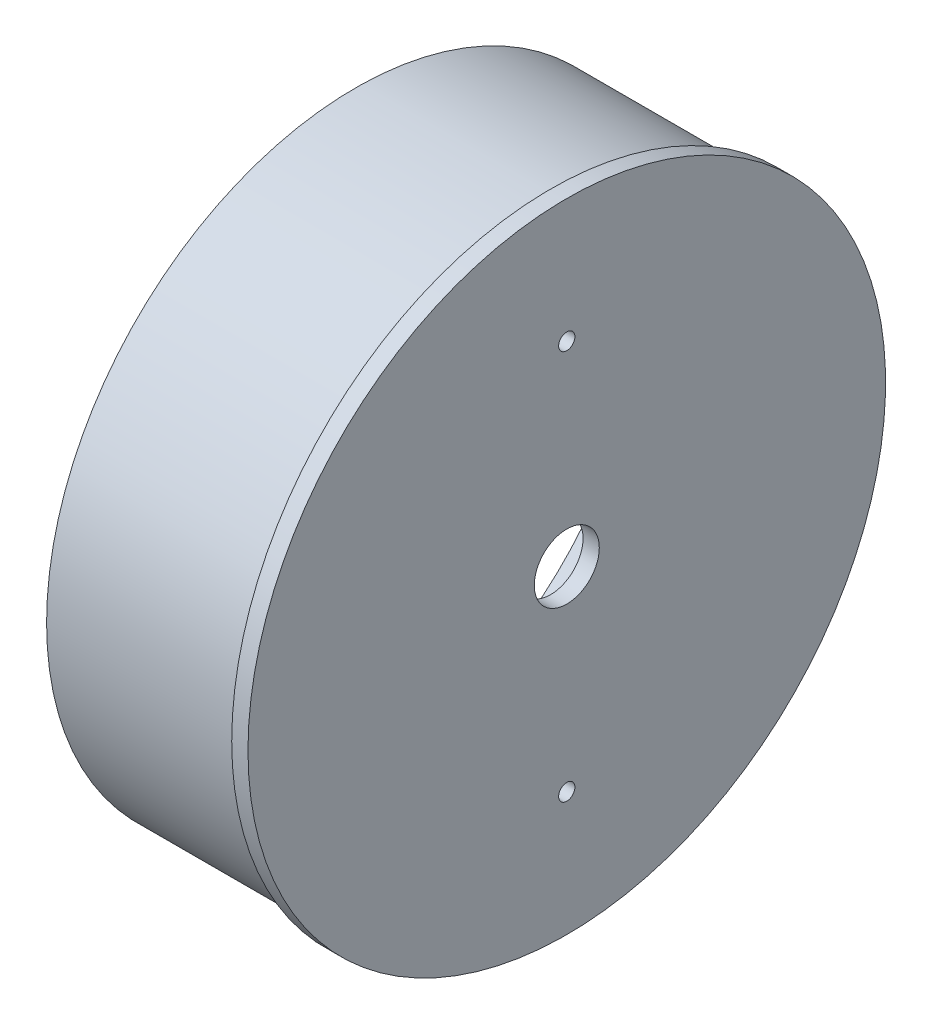
ISO-10303-21;
HEADER;
FILE_DESCRIPTION(('STEP AP214'),'2;1');
FILE_NAME('part.step','',(''),(''),'','','');
FILE_SCHEMA(('AUTOMOTIVE_DESIGN { 1 0 10303 214 1 1 1 1 }'));
ENDSEC;
DATA;
#1=APPLICATION_CONTEXT('core data for automotive mechanical design processes');
#2=APPLICATION_PROTOCOL_DEFINITION('international standard','automotive_design',2000,#1);
#3=PRODUCT_CONTEXT('',#1,'mechanical');
#4=PRODUCT('Part','Part','',(#3));
#5=PRODUCT_RELATED_PRODUCT_CATEGORY('part','',(#4));
#6=PRODUCT_DEFINITION_FORMATION('','',#4);
#7=PRODUCT_DEFINITION_CONTEXT('part definition',#1,'design');
#8=PRODUCT_DEFINITION('design','',#6,#7);
#9=PRODUCT_DEFINITION_SHAPE('','',#8);
#10=(LENGTH_UNIT() NAMED_UNIT(*) SI_UNIT(.MILLI.,.METRE.));
#11=(NAMED_UNIT(*) PLANE_ANGLE_UNIT() SI_UNIT($,.RADIAN.));
#12=(NAMED_UNIT(*) SI_UNIT($,.STERADIAN.) SOLID_ANGLE_UNIT());
#13=UNCERTAINTY_MEASURE_WITH_UNIT(LENGTH_MEASURE(1.E-05),#10,'distance_accuracy_value','');
#14=(GEOMETRIC_REPRESENTATION_CONTEXT(3) GLOBAL_UNCERTAINTY_ASSIGNED_CONTEXT((#13)) GLOBAL_UNIT_ASSIGNED_CONTEXT((#10,
#11,#12)) REPRESENTATION_CONTEXT('',''));
#15=CARTESIAN_POINT('',(0.,0.,0.));
#16=DIRECTION('',(0.,0.,1.));
#17=DIRECTION('',(1.,0.,0.));
#18=AXIS2_PLACEMENT_3D('',#15,#16,#17);
#19=CARTESIAN_POINT('',(9.6263641719796,0.,0.));
#20=DIRECTION('',(1.,0.,0.));
#21=DIRECTION('',(0.,0.,-1.));
#22=AXIS2_PLACEMENT_3D('',#19,#20,#21);
#23=PLANE('',#22);
#24=CARTESIAN_POINT('',(9.6263641719796,-23.7884062483926,0.));
#25=DIRECTION('',(-1.,0.,0.));
#26=DIRECTION('',(0.,0.,1.));
#27=AXIS2_PLACEMENT_3D('',#24,#25,#26);
#28=CIRCLE('',#27,49.03);
#29=CARTESIAN_POINT('',(9.6263641719796,-23.7884062483926,49.03));
#30=VERTEX_POINT('',#29);
#31=EDGE_CURVE('E10',#30,#30,#28,.T.);
#32=ORIENTED_EDGE('',*,*,#31,.F.);
#33=EDGE_LOOP('',(#32));
#34=FACE_BOUND('',#33,.T.);
#35=CARTESIAN_POINT('',(9.6263641719796,-23.7884062483926,0.));
#36=DIRECTION('',(1.,0.,0.));
#37=DIRECTION('',(0.,0.,-1.));
#38=AXIS2_PLACEMENT_3D('',#35,#36,#37);
#39=CIRCLE('',#38,5.);
#40=CARTESIAN_POINT('',(9.6263641719796,-23.7884062483926,-5.));
#41=VERTEX_POINT('',#40);
#42=EDGE_CURVE('E70',#41,#41,#39,.T.);
#43=ORIENTED_EDGE('',*,*,#42,.F.);
#44=EDGE_LOOP('',(#43));
#45=FACE_BOUND('',#44,.T.);
#46=CARTESIAN_POINT('',(9.6263641719796,-53.7884062483926,0.));
#47=DIRECTION('',(1.,0.,0.));
#48=DIRECTION('',(0.,0.,-1.));
#49=AXIS2_PLACEMENT_3D('',#46,#47,#48);
#50=CIRCLE('',#49,1.25);
#51=CARTESIAN_POINT('',(9.6263641719796,-53.7884062483926,-1.25000000000001));
#52=VERTEX_POINT('',#51);
#53=EDGE_CURVE('E131',#52,#52,#50,.T.);
#54=ORIENTED_EDGE('',*,*,#53,.F.);
#55=EDGE_LOOP('',(#54));
#56=FACE_BOUND('',#55,.T.);
#57=CARTESIAN_POINT('',(9.6263641719796,6.21159375160744,0.));
#58=DIRECTION('',(1.,0.,0.));
#59=DIRECTION('',(0.,0.,-1.));
#60=AXIS2_PLACEMENT_3D('',#57,#58,#59);
#61=CIRCLE('',#60,1.25);
#62=CARTESIAN_POINT('',(9.6263641719796,6.21159375160744,-1.25000000000001));
#63=VERTEX_POINT('',#62);
#64=EDGE_CURVE('E134',#63,#63,#61,.F.);
#65=ORIENTED_EDGE('',*,*,#64,.T.);
#66=EDGE_LOOP('',(#65));
#67=FACE_BOUND('',#66,.T.);
#68=ADVANCED_FACE('F47',(#34,#45,#56,#67),#23,.T.);
#69=CARTESIAN_POINT('',(7.12636417197965,0.,0.));
#70=DIRECTION('',(1.,0.,0.));
#71=DIRECTION('',(0.,0.,-1.));
#72=AXIS2_PLACEMENT_3D('',#69,#70,#71);
#73=PLANE('',#72);
#74=CARTESIAN_POINT('',(7.12636417197965,-53.7884062483926,0.));
#75=DIRECTION('',(1.,0.,0.));
#76=DIRECTION('',(0.,0.,-1.));
#77=AXIS2_PLACEMENT_3D('',#74,#75,#76);
#78=CIRCLE('',#77,1.25);
#79=CARTESIAN_POINT('',(7.12636417197965,-53.7884062483926,-1.25000000000001));
#80=VERTEX_POINT('',#79);
#81=EDGE_CURVE('E69',#80,#80,#78,.T.);
#82=ORIENTED_EDGE('',*,*,#81,.T.);
#83=EDGE_LOOP('',(#82));
#84=FACE_BOUND('',#83,.T.);
#85=CARTESIAN_POINT('',(7.12636417197965,-23.7884062483926,0.));
#86=DIRECTION('',(1.,0.,0.));
#87=DIRECTION('',(0.,0.,-1.));
#88=AXIS2_PLACEMENT_3D('',#85,#86,#87);
#89=CIRCLE('',#88,5.);
#90=CARTESIAN_POINT('',(7.12636417197965,-23.7884062483926,-5.));
#91=VERTEX_POINT('',#90);
#92=EDGE_CURVE('E66',#91,#91,#89,.T.);
#93=ORIENTED_EDGE('',*,*,#92,.T.);
#94=EDGE_LOOP('',(#93));
#95=FACE_BOUND('',#94,.T.);
#96=CARTESIAN_POINT('',(7.12636417197965,-23.7884062483926,0.));
#97=DIRECTION('',(-1.,0.,0.));
#98=DIRECTION('',(0.,0.,1.));
#99=AXIS2_PLACEMENT_3D('',#96,#97,#98);
#100=CIRCLE('',#99,45.);
#101=CARTESIAN_POINT('',(7.12636417197965,-23.7884062483926,45.));
#102=VERTEX_POINT('',#101);
#103=EDGE_CURVE('E78',#102,#102,#100,.T.);
#104=ORIENTED_EDGE('',*,*,#103,.T.);
#105=EDGE_LOOP('',(#104));
#106=FACE_BOUND('',#105,.T.);
#107=CARTESIAN_POINT('',(7.12636417197965,6.21159375160744,0.));
#108=DIRECTION('',(1.,0.,0.));
#109=DIRECTION('',(0.,0.,-1.));
#110=AXIS2_PLACEMENT_3D('',#107,#108,#109);
#111=CIRCLE('',#110,1.25);
#112=CARTESIAN_POINT('',(7.12636417197965,6.21159375160744,-1.25000000000001));
#113=VERTEX_POINT('',#112);
#114=EDGE_CURVE('E50',#113,#113,#111,.F.);
#115=ORIENTED_EDGE('',*,*,#114,.F.);
#116=EDGE_LOOP('',(#115));
#117=FACE_BOUND('',#116,.T.);
#118=ADVANCED_FACE('F110',(#84,#95,#106,#117),#73,.F.);
#119=CARTESIAN_POINT('',(7.12636417197965,-23.7884062483926,0.));
#120=DIRECTION('',(-1.,0.,0.));
#121=DIRECTION('',(0.,0.,1.));
#122=AXIS2_PLACEMENT_3D('',#119,#120,#121);
#123=CYLINDRICAL_SURFACE('',#122,49.03);
#124=ORIENTED_EDGE('',*,*,#31,.T.);
#125=EDGE_LOOP('',(#124));
#126=FACE_BOUND('',#125,.T.);
#127=CARTESIAN_POINT('',(7.12636417197965,-23.7884062483926,0.));
#128=DIRECTION('',(-1.,0.,0.));
#129=DIRECTION('',(0.,0.,1.));
#130=AXIS2_PLACEMENT_3D('',#127,#128,#129);
#131=CIRCLE('',#130,49.03);
#132=CARTESIAN_POINT('',(7.12636417197965,-23.7884062483926,49.03));
#133=VERTEX_POINT('',#132);
#134=EDGE_CURVE('E55',#133,#133,#131,.T.);
#135=ORIENTED_EDGE('',*,*,#134,.F.);
#136=EDGE_LOOP('',(#135));
#137=FACE_BOUND('',#136,.T.);
#138=ADVANCED_FACE('F108',(#126,#137),#123,.T.);
#139=CARTESIAN_POINT('',(7.12636417197965,-23.7884062483926,0.));
#140=DIRECTION('',(-1.,0.,0.));
#141=DIRECTION('',(0.,0.,1.));
#142=AXIS2_PLACEMENT_3D('',#139,#140,#141);
#143=CIRCLE('',#142,47.5);
#144=CARTESIAN_POINT('',(7.12636417197965,-23.7884062483926,47.5));
#145=VERTEX_POINT('',#144);
#146=EDGE_CURVE('E62',#145,#145,#143,.T.);
#147=ORIENTED_EDGE('',*,*,#146,.F.);
#148=EDGE_LOOP('',(#147));
#149=FACE_BOUND('',#148,.T.);
#150=ORIENTED_EDGE('',*,*,#134,.T.);
#151=EDGE_LOOP('',(#150));
#152=FACE_BOUND('',#151,.T.);
#153=ADVANCED_FACE('F105',(#149,#152),#73,.F.);
#154=CARTESIAN_POINT('',(7.12636417197965,-23.7884062483926,0.));
#155=DIRECTION('',(-1.,0.,0.));
#156=DIRECTION('',(0.,0.,1.));
#157=AXIS2_PLACEMENT_3D('',#154,#155,#156);
#158=CYLINDRICAL_SURFACE('',#157,47.5);
#159=CARTESIAN_POINT('',(-22.8736358280204,-23.7884062483926,0.));
#160=DIRECTION('',(-1.,0.,0.));
#161=DIRECTION('',(0.,0.,1.));
#162=AXIS2_PLACEMENT_3D('',#159,#160,#161);
#163=CIRCLE('',#162,47.5);
#164=CARTESIAN_POINT('',(-22.8736358280204,-23.7884062483926,47.5));
#165=VERTEX_POINT('',#164);
#166=EDGE_CURVE('E91',#165,#165,#163,.T.);
#167=ORIENTED_EDGE('',*,*,#166,.F.);
#168=EDGE_LOOP('',(#167));
#169=FACE_BOUND('',#168,.T.);
#170=ORIENTED_EDGE('',*,*,#146,.T.);
#171=EDGE_LOOP('',(#170));
#172=FACE_BOUND('',#171,.T.);
#173=ADVANCED_FACE('F103',(#169,#172),#158,.T.);
#174=CARTESIAN_POINT('',(-22.8736358280204,0.,0.));
#175=DIRECTION('',(1.,0.,0.));
#176=DIRECTION('',(0.,0.,-1.));
#177=AXIS2_PLACEMENT_3D('',#174,#175,#176);
#178=PLANE('',#177);
#179=CARTESIAN_POINT('',(-22.8736358280204,-23.7884062483926,0.));
#180=DIRECTION('',(-1.,0.,0.));
#181=DIRECTION('',(0.,0.,1.));
#182=AXIS2_PLACEMENT_3D('',#179,#180,#181);
#183=CIRCLE('',#182,45.);
#184=CARTESIAN_POINT('',(-22.8736358280204,-23.7884062483926,45.));
#185=VERTEX_POINT('',#184);
#186=EDGE_CURVE('E84',#185,#185,#183,.T.);
#187=ORIENTED_EDGE('',*,*,#186,.F.);
#188=EDGE_LOOP('',(#187));
#189=FACE_BOUND('',#188,.T.);
#190=ORIENTED_EDGE('',*,*,#166,.T.);
#191=EDGE_LOOP('',(#190));
#192=FACE_BOUND('',#191,.T.);
#193=ADVANCED_FACE('F162',(#189,#192),#178,.F.);
#194=CARTESIAN_POINT('',(7.12636417197965,-23.7884062483926,0.));
#195=DIRECTION('',(-1.,0.,0.));
#196=DIRECTION('',(0.,0.,1.));
#197=AXIS2_PLACEMENT_3D('',#194,#195,#196);
#198=CYLINDRICAL_SURFACE('',#197,45.);
#199=ORIENTED_EDGE('',*,*,#186,.T.);
#200=EDGE_LOOP('',(#199));
#201=FACE_BOUND('',#200,.T.);
#202=ORIENTED_EDGE('',*,*,#103,.F.);
#203=EDGE_LOOP('',(#202));
#204=FACE_BOUND('',#203,.T.);
#205=ADVANCED_FACE('F149',(#201,#204),#198,.F.);
#206=CARTESIAN_POINT('',(-0.373635828020191,-23.7884062483926,0.));
#207=DIRECTION('',(1.,0.,0.));
#208=DIRECTION('',(0.,0.,-1.));
#209=AXIS2_PLACEMENT_3D('',#206,#207,#208);
#210=CYLINDRICAL_SURFACE('',#209,5.);
#211=ORIENTED_EDGE('',*,*,#42,.T.);
#212=EDGE_LOOP('',(#211));
#213=FACE_BOUND('',#212,.T.);
#214=ORIENTED_EDGE('',*,*,#92,.F.);
#215=EDGE_LOOP('',(#214));
#216=FACE_BOUND('',#215,.T.);
#217=ADVANCED_FACE('F145',(#213,#216),#210,.F.);
#218=CARTESIAN_POINT('',(-0.373635828020191,-53.7884062483926,0.));
#219=DIRECTION('',(1.,0.,0.));
#220=DIRECTION('',(0.,0.,-1.));
#221=AXIS2_PLACEMENT_3D('',#218,#219,#220);
#222=CYLINDRICAL_SURFACE('',#221,1.25);
#223=ORIENTED_EDGE('',*,*,#53,.T.);
#224=EDGE_LOOP('',(#223));
#225=FACE_BOUND('',#224,.T.);
#226=ORIENTED_EDGE('',*,*,#81,.F.);
#227=EDGE_LOOP('',(#226));
#228=FACE_BOUND('',#227,.T.);
#229=ADVANCED_FACE('F148',(#225,#228),#222,.F.);
#230=CARTESIAN_POINT('',(-0.373635828020191,6.21159375160744,0.));
#231=DIRECTION('',(1.,0.,0.));
#232=DIRECTION('',(0.,0.,-1.));
#233=AXIS2_PLACEMENT_3D('',#230,#231,#232);
#234=CYLINDRICAL_SURFACE('',#233,1.25);
#235=ORIENTED_EDGE('',*,*,#64,.F.);
#236=EDGE_LOOP('',(#235));
#237=FACE_BOUND('',#236,.T.);
#238=ORIENTED_EDGE('',*,*,#114,.T.);
#239=EDGE_LOOP('',(#238));
#240=FACE_BOUND('',#239,.T.);
#241=ADVANCED_FACE('F159',(#237,#240),#234,.F.);
#242=CLOSED_SHELL('',(#68,#118,#138,#153,#173,#193,#205,#217,#229,#241));
#243=MANIFOLD_SOLID_BREP('B2',#242);
#244=ADVANCED_BREP_SHAPE_REPRESENTATION('',(#18,#243),#14);
#245=SHAPE_DEFINITION_REPRESENTATION(#9,#244);
ENDSEC;
END-ISO-10303-21;
